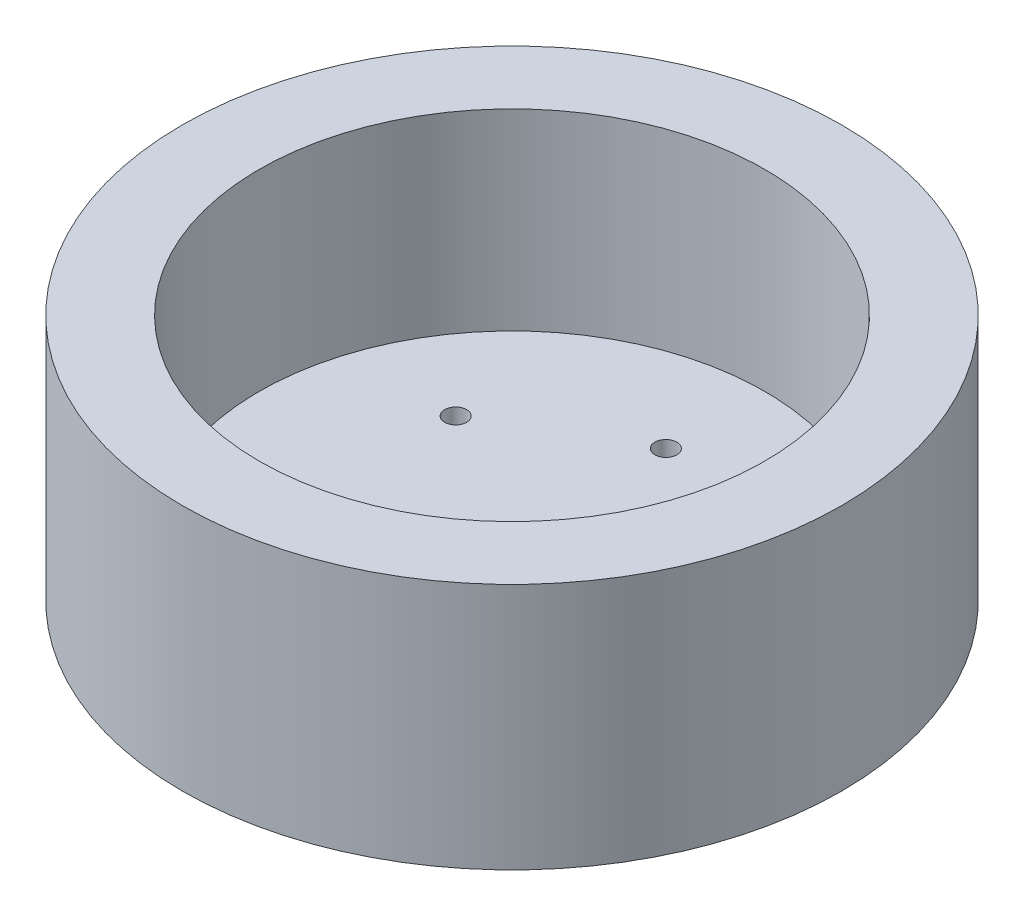
ISO-10303-21;
HEADER;
FILE_DESCRIPTION(('STEP AP214'),'2;1');
FILE_NAME('part.step','',(''),(''),'','','');
FILE_SCHEMA(('AUTOMOTIVE_DESIGN { 1 0 10303 214 1 1 1 1 }'));
ENDSEC;
DATA;
#1=APPLICATION_CONTEXT('core data for automotive mechanical design processes');
#2=APPLICATION_PROTOCOL_DEFINITION('international standard','automotive_design',2000,#1);
#3=PRODUCT_CONTEXT('',#1,'mechanical');
#4=PRODUCT('Part','Part','',(#3));
#5=PRODUCT_RELATED_PRODUCT_CATEGORY('part','',(#4));
#6=PRODUCT_DEFINITION_FORMATION('','',#4);
#7=PRODUCT_DEFINITION_CONTEXT('part definition',#1,'design');
#8=PRODUCT_DEFINITION('design','',#6,#7);
#9=PRODUCT_DEFINITION_SHAPE('','',#8);
#10=(LENGTH_UNIT() NAMED_UNIT(*) SI_UNIT(.MILLI.,.METRE.));
#11=(NAMED_UNIT(*) PLANE_ANGLE_UNIT() SI_UNIT($,.RADIAN.));
#12=(NAMED_UNIT(*) SI_UNIT($,.STERADIAN.) SOLID_ANGLE_UNIT());
#13=UNCERTAINTY_MEASURE_WITH_UNIT(LENGTH_MEASURE(1.E-05),#10,'distance_accuracy_value','');
#14=(GEOMETRIC_REPRESENTATION_CONTEXT(3) GLOBAL_UNCERTAINTY_ASSIGNED_CONTEXT((#13)) GLOBAL_UNIT_ASSIGNED_CONTEXT((#10,
#11,#12)) REPRESENTATION_CONTEXT('',''));
#15=CARTESIAN_POINT('',(0.,0.,0.));
#16=DIRECTION('',(0.,0.,1.));
#17=DIRECTION('',(1.,0.,0.));
#18=AXIS2_PLACEMENT_3D('',#15,#16,#17);
#19=CARTESIAN_POINT('',(0.,10.,0.));
#20=DIRECTION('',(0.,1.,0.));
#21=DIRECTION('',(0.,0.,1.));
#22=AXIS2_PLACEMENT_3D('',#19,#20,#21);
#23=PLANE('',#22);
#24=CARTESIAN_POINT('',(-24.2487113059638,10.,-13.9999999999991));
#25=DIRECTION('',(0.,1.,0.));
#26=DIRECTION('',(0.,0.,1.));
#27=AXIS2_PLACEMENT_3D('',#24,#25,#26);
#28=CIRCLE('',#27,2.);
#29=CARTESIAN_POINT('',(-24.2487113059638,10.,-11.9999999999991));
#30=VERTEX_POINT('',#29);
#31=EDGE_CURVE('E73',#30,#30,#28,.T.);
#32=ORIENTED_EDGE('',*,*,#31,.F.);
#33=EDGE_LOOP('',(#32));
#34=FACE_BOUND('',#33,.T.);
#35=CARTESIAN_POINT('',(2.12281075032644E-12,10.,28.));
#36=DIRECTION('',(0.,1.,0.));
#37=DIRECTION('',(0.,0.,1.));
#38=AXIS2_PLACEMENT_3D('',#35,#36,#37);
#39=CIRCLE('',#38,2.);
#40=CARTESIAN_POINT('',(2.12281075032644E-12,10.,30.));
#41=VERTEX_POINT('',#40);
#42=EDGE_CURVE('E61',#41,#41,#39,.T.);
#43=ORIENTED_EDGE('',*,*,#42,.F.);
#44=EDGE_LOOP('',(#43));
#45=FACE_BOUND('',#44,.T.);
#46=CARTESIAN_POINT('',(24.2487113059648,10.,-14.0000000000009));
#47=DIRECTION('',(0.,1.,0.));
#48=DIRECTION('',(0.,0.,1.));
#49=AXIS2_PLACEMENT_3D('',#46,#47,#48);
#50=CIRCLE('',#49,2.);
#51=CARTESIAN_POINT('',(24.2487113059648,10.,-12.0000000000009));
#52=VERTEX_POINT('',#51);
#53=EDGE_CURVE('E50',#52,#52,#50,.T.);
#54=ORIENTED_EDGE('',*,*,#53,.F.);
#55=EDGE_LOOP('',(#54));
#56=FACE_BOUND('',#55,.T.);
#57=CARTESIAN_POINT('',(0.,10.,-28.));
#58=DIRECTION('',(0.,1.,0.));
#59=DIRECTION('',(0.,0.,1.));
#60=AXIS2_PLACEMENT_3D('',#57,#58,#59);
#61=CIRCLE('',#60,2.);
#62=CARTESIAN_POINT('',(0.,10.,-26.));
#63=VERTEX_POINT('',#62);
#64=EDGE_CURVE('E42',#63,#63,#61,.T.);
#65=ORIENTED_EDGE('',*,*,#64,.F.);
#66=EDGE_LOOP('',(#65));
#67=FACE_BOUND('',#66,.T.);
#68=CARTESIAN_POINT('',(24.2487113059659,10.,13.9999999999991));
#69=DIRECTION('',(0.,1.,0.));
#70=DIRECTION('',(0.,0.,1.));
#71=AXIS2_PLACEMENT_3D('',#68,#69,#70);
#72=CIRCLE('',#71,2.);
#73=CARTESIAN_POINT('',(24.2487113059659,10.,15.9999999999991));
#74=VERTEX_POINT('',#73);
#75=EDGE_CURVE('E55',#74,#74,#72,.T.);
#76=ORIENTED_EDGE('',*,*,#75,.F.);
#77=EDGE_LOOP('',(#76));
#78=FACE_BOUND('',#77,.T.);
#79=CARTESIAN_POINT('',(-24.2487113059627,10.,14.0000000000009));
#80=DIRECTION('',(0.,1.,0.));
#81=DIRECTION('',(0.,0.,1.));
#82=AXIS2_PLACEMENT_3D('',#79,#80,#81);
#83=CIRCLE('',#82,2.);
#84=CARTESIAN_POINT('',(-24.2487113059627,10.,16.0000000000009));
#85=VERTEX_POINT('',#84);
#86=EDGE_CURVE('E67',#85,#85,#83,.T.);
#87=ORIENTED_EDGE('',*,*,#86,.F.);
#88=EDGE_LOOP('',(#87));
#89=FACE_BOUND('',#88,.T.);
#90=CARTESIAN_POINT('',(0.,10.,0.));
#91=DIRECTION('',(0.,1.,0.));
#92=DIRECTION('',(0.,0.,1.));
#93=AXIS2_PLACEMENT_3D('',#90,#91,#92);
#94=CIRCLE('',#93,46.);
#95=CARTESIAN_POINT('',(0.,10.,46.));
#96=VERTEX_POINT('',#95);
#97=EDGE_CURVE('E10',#96,#96,#94,.F.);
#98=ORIENTED_EDGE('',*,*,#97,.F.);
#99=EDGE_LOOP('',(#98));
#100=FACE_BOUND('',#99,.T.);
#101=ADVANCED_FACE('F31',(#34,#45,#56,#67,#78,#89,#100),#23,.T.);
#102=CARTESIAN_POINT('',(0.,0.,0.));
#103=DIRECTION('',(0.,1.,0.));
#104=DIRECTION('',(0.,0.,1.));
#105=AXIS2_PLACEMENT_3D('',#102,#103,#104);
#106=PLANE('',#105);
#107=CARTESIAN_POINT('',(0.,0.,0.));
#108=DIRECTION('',(0.,1.,0.));
#109=DIRECTION('',(0.,0.,1.));
#110=AXIS2_PLACEMENT_3D('',#107,#108,#109);
#111=CIRCLE('',#110,60.);
#112=CARTESIAN_POINT('',(0.,0.,60.));
#113=VERTEX_POINT('',#112);
#114=EDGE_CURVE('E38',#113,#113,#111,.T.);
#115=ORIENTED_EDGE('',*,*,#114,.F.);
#116=EDGE_LOOP('',(#115));
#117=FACE_BOUND('',#116,.T.);
#118=CARTESIAN_POINT('',(0.,0.,-28.));
#119=DIRECTION('',(0.,1.,0.));
#120=DIRECTION('',(0.,0.,1.));
#121=AXIS2_PLACEMENT_3D('',#118,#119,#120);
#122=CIRCLE('',#121,2.);
#123=CARTESIAN_POINT('',(0.,0.,-26.));
#124=VERTEX_POINT('',#123);
#125=EDGE_CURVE('E46',#124,#124,#122,.T.);
#126=ORIENTED_EDGE('',*,*,#125,.T.);
#127=EDGE_LOOP('',(#126));
#128=FACE_BOUND('',#127,.T.);
#129=CARTESIAN_POINT('',(24.2487113059648,0.,-14.0000000000009));
#130=DIRECTION('',(0.,1.,0.));
#131=DIRECTION('',(0.,0.,1.));
#132=AXIS2_PLACEMENT_3D('',#129,#130,#131);
#133=CIRCLE('',#132,2.);
#134=CARTESIAN_POINT('',(24.2487113059648,0.,-12.0000000000009));
#135=VERTEX_POINT('',#134);
#136=EDGE_CURVE('E52',#135,#135,#133,.T.);
#137=ORIENTED_EDGE('',*,*,#136,.T.);
#138=EDGE_LOOP('',(#137));
#139=FACE_BOUND('',#138,.T.);
#140=CARTESIAN_POINT('',(24.2487113059659,0.,13.9999999999991));
#141=DIRECTION('',(0.,1.,0.));
#142=DIRECTION('',(0.,0.,1.));
#143=AXIS2_PLACEMENT_3D('',#140,#141,#142);
#144=CIRCLE('',#143,2.);
#145=CARTESIAN_POINT('',(24.2487113059659,0.,15.9999999999991));
#146=VERTEX_POINT('',#145);
#147=EDGE_CURVE('E58',#146,#146,#144,.T.);
#148=ORIENTED_EDGE('',*,*,#147,.T.);
#149=EDGE_LOOP('',(#148));
#150=FACE_BOUND('',#149,.T.);
#151=CARTESIAN_POINT('',(2.12281075032644E-12,0.,28.));
#152=DIRECTION('',(0.,1.,0.));
#153=DIRECTION('',(0.,0.,1.));
#154=AXIS2_PLACEMENT_3D('',#151,#152,#153);
#155=CIRCLE('',#154,2.);
#156=CARTESIAN_POINT('',(2.12281075032644E-12,0.,30.));
#157=VERTEX_POINT('',#156);
#158=EDGE_CURVE('E64',#157,#157,#155,.T.);
#159=ORIENTED_EDGE('',*,*,#158,.T.);
#160=EDGE_LOOP('',(#159));
#161=FACE_BOUND('',#160,.T.);
#162=CARTESIAN_POINT('',(-24.2487113059627,0.,14.0000000000009));
#163=DIRECTION('',(0.,1.,0.));
#164=DIRECTION('',(0.,0.,1.));
#165=AXIS2_PLACEMENT_3D('',#162,#163,#164);
#166=CIRCLE('',#165,2.);
#167=CARTESIAN_POINT('',(-24.2487113059627,0.,16.0000000000009));
#168=VERTEX_POINT('',#167);
#169=EDGE_CURVE('E70',#168,#168,#166,.T.);
#170=ORIENTED_EDGE('',*,*,#169,.T.);
#171=EDGE_LOOP('',(#170));
#172=FACE_BOUND('',#171,.T.);
#173=CARTESIAN_POINT('',(-24.2487113059638,0.,-13.9999999999991));
#174=DIRECTION('',(0.,1.,0.));
#175=DIRECTION('',(0.,0.,1.));
#176=AXIS2_PLACEMENT_3D('',#173,#174,#175);
#177=CIRCLE('',#176,2.);
#178=CARTESIAN_POINT('',(-24.2487113059638,0.,-11.9999999999991));
#179=VERTEX_POINT('',#178);
#180=EDGE_CURVE('E76',#179,#179,#177,.T.);
#181=ORIENTED_EDGE('',*,*,#180,.T.);
#182=EDGE_LOOP('',(#181));
#183=FACE_BOUND('',#182,.T.);
#184=ADVANCED_FACE('F104',(#117,#128,#139,#150,#161,#172,#183),#106,.F.);
#185=CARTESIAN_POINT('',(0.,10.,0.));
#186=DIRECTION('',(0.,-1.,0.));
#187=DIRECTION('',(0.,0.,-1.));
#188=AXIS2_PLACEMENT_3D('',#185,#186,#187);
#189=CYLINDRICAL_SURFACE('',#188,60.);
#190=ORIENTED_EDGE('',*,*,#114,.T.);
#191=EDGE_LOOP('',(#190));
#192=FACE_BOUND('',#191,.T.);
#193=CARTESIAN_POINT('',(0.,45.,0.));
#194=DIRECTION('',(0.,1.,0.));
#195=DIRECTION('',(0.,0.,1.));
#196=AXIS2_PLACEMENT_3D('',#193,#194,#195);
#197=CIRCLE('',#196,60.);
#198=CARTESIAN_POINT('',(0.,45.,60.));
#199=VERTEX_POINT('',#198);
#200=EDGE_CURVE('E79',#199,#199,#197,.T.);
#201=ORIENTED_EDGE('',*,*,#200,.F.);
#202=EDGE_LOOP('',(#201));
#203=FACE_BOUND('',#202,.T.);
#204=ADVANCED_FACE('F33',(#192,#203),#189,.T.);
#205=CARTESIAN_POINT('',(0.,10.,-28.));
#206=DIRECTION('',(0.,-1.,0.));
#207=DIRECTION('',(0.,0.,-1.));
#208=AXIS2_PLACEMENT_3D('',#205,#206,#207);
#209=CYLINDRICAL_SURFACE('',#208,2.);
#210=ORIENTED_EDGE('',*,*,#64,.T.);
#211=EDGE_LOOP('',(#210));
#212=FACE_BOUND('',#211,.T.);
#213=ORIENTED_EDGE('',*,*,#125,.F.);
#214=EDGE_LOOP('',(#213));
#215=FACE_BOUND('',#214,.T.);
#216=ADVANCED_FACE('F114',(#212,#215),#209,.F.);
#217=CARTESIAN_POINT('',(24.2487113059648,10.,-14.0000000000009));
#218=DIRECTION('',(0.,-1.,0.));
#219=DIRECTION('',(0.,0.,-1.));
#220=AXIS2_PLACEMENT_3D('',#217,#218,#219);
#221=CYLINDRICAL_SURFACE('',#220,2.);
#222=ORIENTED_EDGE('',*,*,#53,.T.);
#223=EDGE_LOOP('',(#222));
#224=FACE_BOUND('',#223,.T.);
#225=ORIENTED_EDGE('',*,*,#136,.F.);
#226=EDGE_LOOP('',(#225));
#227=FACE_BOUND('',#226,.T.);
#228=ADVANCED_FACE('F117',(#224,#227),#221,.F.);
#229=CARTESIAN_POINT('',(24.2487113059659,10.,13.9999999999991));
#230=DIRECTION('',(0.,-1.,0.));
#231=DIRECTION('',(0.,0.,-1.));
#232=AXIS2_PLACEMENT_3D('',#229,#230,#231);
#233=CYLINDRICAL_SURFACE('',#232,2.);
#234=ORIENTED_EDGE('',*,*,#75,.T.);
#235=EDGE_LOOP('',(#234));
#236=FACE_BOUND('',#235,.T.);
#237=ORIENTED_EDGE('',*,*,#147,.F.);
#238=EDGE_LOOP('',(#237));
#239=FACE_BOUND('',#238,.T.);
#240=ADVANCED_FACE('F121',(#236,#239),#233,.F.);
#241=CARTESIAN_POINT('',(2.12281075032644E-12,10.,28.));
#242=DIRECTION('',(0.,-1.,0.));
#243=DIRECTION('',(0.,0.,-1.));
#244=AXIS2_PLACEMENT_3D('',#241,#242,#243);
#245=CYLINDRICAL_SURFACE('',#244,2.);
#246=ORIENTED_EDGE('',*,*,#42,.T.);
#247=EDGE_LOOP('',(#246));
#248=FACE_BOUND('',#247,.T.);
#249=ORIENTED_EDGE('',*,*,#158,.F.);
#250=EDGE_LOOP('',(#249));
#251=FACE_BOUND('',#250,.T.);
#252=ADVANCED_FACE('F125',(#248,#251),#245,.F.);
#253=CARTESIAN_POINT('',(-24.2487113059627,10.,14.0000000000009));
#254=DIRECTION('',(0.,-1.,0.));
#255=DIRECTION('',(0.,0.,-1.));
#256=AXIS2_PLACEMENT_3D('',#253,#254,#255);
#257=CYLINDRICAL_SURFACE('',#256,2.);
#258=ORIENTED_EDGE('',*,*,#86,.T.);
#259=EDGE_LOOP('',(#258));
#260=FACE_BOUND('',#259,.T.);
#261=ORIENTED_EDGE('',*,*,#169,.F.);
#262=EDGE_LOOP('',(#261));
#263=FACE_BOUND('',#262,.T.);
#264=ADVANCED_FACE('F100',(#260,#263),#257,.F.);
#265=CARTESIAN_POINT('',(-24.2487113059638,10.,-13.9999999999991));
#266=DIRECTION('',(0.,-1.,0.));
#267=DIRECTION('',(0.,0.,-1.));
#268=AXIS2_PLACEMENT_3D('',#265,#266,#267);
#269=CYLINDRICAL_SURFACE('',#268,2.);
#270=ORIENTED_EDGE('',*,*,#31,.T.);
#271=EDGE_LOOP('',(#270));
#272=FACE_BOUND('',#271,.T.);
#273=ORIENTED_EDGE('',*,*,#180,.F.);
#274=EDGE_LOOP('',(#273));
#275=FACE_BOUND('',#274,.T.);
#276=ADVANCED_FACE('F92',(#272,#275),#269,.F.);
#277=CARTESIAN_POINT('',(0.,45.,0.));
#278=DIRECTION('',(0.,1.,0.));
#279=DIRECTION('',(0.,0.,1.));
#280=AXIS2_PLACEMENT_3D('',#277,#278,#279);
#281=PLANE('',#280);
#282=ORIENTED_EDGE('',*,*,#200,.T.);
#283=EDGE_LOOP('',(#282));
#284=FACE_BOUND('',#283,.T.);
#285=CARTESIAN_POINT('',(0.,45.,0.));
#286=DIRECTION('',(0.,1.,0.));
#287=DIRECTION('',(0.,0.,1.));
#288=AXIS2_PLACEMENT_3D('',#285,#286,#287);
#289=CIRCLE('',#288,46.);
#290=CARTESIAN_POINT('',(0.,45.,46.));
#291=VERTEX_POINT('',#290);
#292=EDGE_CURVE('E84',#291,#291,#289,.T.);
#293=ORIENTED_EDGE('',*,*,#292,.F.);
#294=EDGE_LOOP('',(#293));
#295=FACE_BOUND('',#294,.T.);
#296=ADVANCED_FACE('F90',(#284,#295),#281,.T.);
#297=CARTESIAN_POINT('',(0.,45.,0.));
#298=DIRECTION('',(0.,-1.,0.));
#299=DIRECTION('',(0.,0.,-1.));
#300=AXIS2_PLACEMENT_3D('',#297,#298,#299);
#301=CYLINDRICAL_SURFACE('',#300,46.);
#302=ORIENTED_EDGE('',*,*,#292,.T.);
#303=EDGE_LOOP('',(#302));
#304=FACE_BOUND('',#303,.T.);
#305=ORIENTED_EDGE('',*,*,#97,.T.);
#306=EDGE_LOOP('',(#305));
#307=FACE_BOUND('',#306,.T.);
#308=ADVANCED_FACE('F88',(#304,#307),#301,.F.);
#309=CLOSED_SHELL('',(#101,#184,#204,#216,#228,#240,#252,#264,#276,#296,#308));
#310=MANIFOLD_SOLID_BREP('B2',#309);
#311=ADVANCED_BREP_SHAPE_REPRESENTATION('',(#18,#310),#14);
#312=SHAPE_DEFINITION_REPRESENTATION(#9,#311);
ENDSEC;
END-ISO-10303-21;
